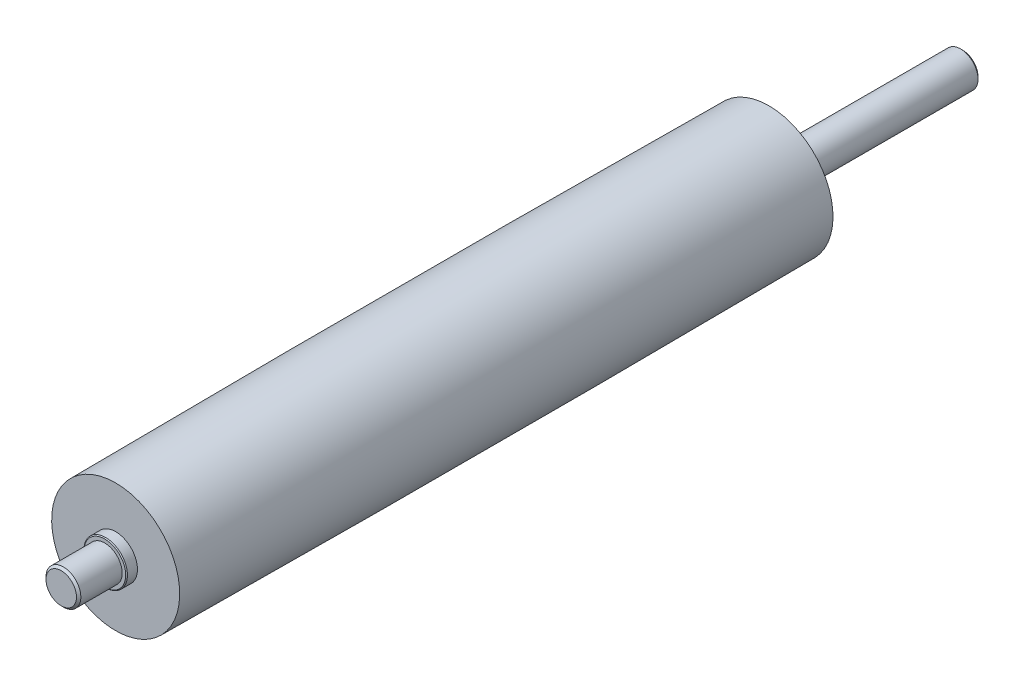
ISO-10303-21;
HEADER;
FILE_DESCRIPTION(('STEP AP214'),'2;1');
FILE_NAME('part.step','',(''),(''),'','','');
FILE_SCHEMA(('AUTOMOTIVE_DESIGN { 1 0 10303 214 1 1 1 1 }'));
ENDSEC;
DATA;
#1=APPLICATION_CONTEXT('core data for automotive mechanical design processes');
#2=APPLICATION_PROTOCOL_DEFINITION('international standard','automotive_design',2000,#1);
#3=PRODUCT_CONTEXT('',#1,'mechanical');
#4=PRODUCT('Part','Part','',(#3));
#5=PRODUCT_RELATED_PRODUCT_CATEGORY('part','',(#4));
#6=PRODUCT_DEFINITION_FORMATION('','',#4);
#7=PRODUCT_DEFINITION_CONTEXT('part definition',#1,'design');
#8=PRODUCT_DEFINITION('design','',#6,#7);
#9=PRODUCT_DEFINITION_SHAPE('','',#8);
#10=(LENGTH_UNIT() NAMED_UNIT(*) SI_UNIT(.MILLI.,.METRE.));
#11=(NAMED_UNIT(*) PLANE_ANGLE_UNIT() SI_UNIT($,.RADIAN.));
#12=(NAMED_UNIT(*) SI_UNIT($,.STERADIAN.) SOLID_ANGLE_UNIT());
#13=UNCERTAINTY_MEASURE_WITH_UNIT(LENGTH_MEASURE(1.E-05),#10,'distance_accuracy_value','');
#14=(GEOMETRIC_REPRESENTATION_CONTEXT(3) GLOBAL_UNCERTAINTY_ASSIGNED_CONTEXT((#13)) GLOBAL_UNIT_ASSIGNED_CONTEXT((#10,
#11,#12)) REPRESENTATION_CONTEXT('',''));
#15=CARTESIAN_POINT('',(0.,0.,0.));
#16=DIRECTION('',(0.,0.,1.));
#17=DIRECTION('',(1.,0.,0.));
#18=AXIS2_PLACEMENT_3D('',#15,#16,#17);
#19=CARTESIAN_POINT('',(0.,0.,-119.5));
#20=DIRECTION('',(0.,0.,-1.));
#21=DIRECTION('',(0.,1.,0.));
#22=AXIS2_PLACEMENT_3D('',#19,#20,#21);
#23=CYLINDRICAL_SURFACE('',#22,6.);
#24=CARTESIAN_POINT('',(0.,0.,-75.));
#25=DIRECTION('',(0.,0.,-1.));
#26=DIRECTION('',(0.,1.,0.));
#27=AXIS2_PLACEMENT_3D('',#24,#25,#26);
#28=CIRCLE('',#27,6.);
#29=CARTESIAN_POINT('',(0.,6.00000000000001,-75.));
#30=VERTEX_POINT('',#29);
#31=EDGE_CURVE('E58',#30,#30,#28,.T.);
#32=ORIENTED_EDGE('',*,*,#31,.T.);
#33=EDGE_LOOP('',(#32));
#34=FACE_BOUND('',#33,.T.);
#35=CARTESIAN_POINT('',(0.,0.,-77.5));
#36=DIRECTION('',(0.,0.,-1.));
#37=DIRECTION('',(0.,1.,0.));
#38=AXIS2_PLACEMENT_3D('',#35,#36,#37);
#39=CIRCLE('',#38,6.);
#40=CARTESIAN_POINT('',(0.,6.00000000000001,-77.5));
#41=VERTEX_POINT('',#40);
#42=EDGE_CURVE('E76',#41,#41,#39,.T.);
#43=ORIENTED_EDGE('',*,*,#42,.F.);
#44=EDGE_LOOP('',(#43));
#45=FACE_BOUND('',#44,.T.);
#46=ADVANCED_FACE('F32',(#34,#45),#23,.T.);
#47=CARTESIAN_POINT('',(0.,6.00000000000001,-75.0000000000005));
#48=DIRECTION('',(0.,0.,-1.));
#49=DIRECTION('',(0.,1.,0.));
#50=AXIS2_PLACEMENT_3D('',#47,#48,#49);
#51=PLANE('',#50);
#52=CARTESIAN_POINT('',(0.,0.,-75.0000000000009));
#53=DIRECTION('',(0.,0.,-1.));
#54=DIRECTION('',(0.,1.,0.));
#55=AXIS2_PLACEMENT_3D('',#52,#53,#54);
#56=CIRCLE('',#55,14.6999999999995);
#57=CARTESIAN_POINT('',(0.,14.6999999999995,-75.0000000000009));
#58=VERTEX_POINT('',#57);
#59=EDGE_CURVE('E61',#58,#58,#56,.T.);
#60=ORIENTED_EDGE('',*,*,#59,.T.);
#61=EDGE_LOOP('',(#60));
#62=FACE_BOUND('',#61,.T.);
#63=ORIENTED_EDGE('',*,*,#31,.F.);
#64=EDGE_LOOP('',(#63));
#65=FACE_BOUND('',#64,.T.);
#66=ADVANCED_FACE('F84',(#62,#65),#51,.T.);
#67=CARTESIAN_POINT('',(0.,0.,1.1518563880486E-12));
#68=DIRECTION('',(0.,0.,-1.));
#69=DIRECTION('',(0.,1.,0.));
#70=AXIS2_PLACEMENT_3D('',#67,#68,#69);
#71=DEGENERATE_TOROIDAL_SURFACE('',#70,9360.15000000304,9375.15000000304,.F.);
#72=CARTESIAN_POINT('',(0.,0.,75.));
#73=DIRECTION('',(0.,0.,-1.));
#74=DIRECTION('',(0.,1.,0.));
#75=AXIS2_PLACEMENT_3D('',#72,#73,#74);
#76=CIRCLE('',#75,14.7000000000001);
#77=CARTESIAN_POINT('',(0.,14.7000000000001,75.));
#78=VERTEX_POINT('',#77);
#79=EDGE_CURVE('E64',#78,#78,#76,.T.);
#80=ORIENTED_EDGE('',*,*,#79,.T.);
#81=EDGE_LOOP('',(#80));
#82=FACE_BOUND('',#81,.T.);
#83=ORIENTED_EDGE('',*,*,#59,.F.);
#84=EDGE_LOOP('',(#83));
#85=FACE_BOUND('',#84,.T.);
#86=ADVANCED_FACE('F90',(#82,#85),#71,.F.);
#87=CARTESIAN_POINT('',(0.,14.7000000000001,75.));
#88=DIRECTION('',(0.,0.,1.));
#89=DIRECTION('',(0.,-1.,0.));
#90=AXIS2_PLACEMENT_3D('',#87,#88,#89);
#91=PLANE('',#90);
#92=CARTESIAN_POINT('',(0.,0.,75.));
#93=DIRECTION('',(0.,0.,-1.));
#94=DIRECTION('',(0.,1.,0.));
#95=AXIS2_PLACEMENT_3D('',#92,#93,#94);
#96=CIRCLE('',#95,5.00000000000001);
#97=CARTESIAN_POINT('',(0.,4.99999999999999,75.));
#98=VERTEX_POINT('',#97);
#99=EDGE_CURVE('E67',#98,#98,#96,.T.);
#100=ORIENTED_EDGE('',*,*,#99,.T.);
#101=EDGE_LOOP('',(#100));
#102=FACE_BOUND('',#101,.T.);
#103=ORIENTED_EDGE('',*,*,#79,.F.);
#104=EDGE_LOOP('',(#103));
#105=FACE_BOUND('',#104,.T.);
#106=ADVANCED_FACE('F134',(#102,#105),#91,.T.);
#107=CARTESIAN_POINT('',(0.,0.,-119.5));
#108=DIRECTION('',(0.,0.,-1.));
#109=DIRECTION('',(0.,1.,0.));
#110=AXIS2_PLACEMENT_3D('',#107,#108,#109);
#111=CYLINDRICAL_SURFACE('',#110,5.00000000000001);
#112=CARTESIAN_POINT('',(0.,0.,77.3));
#113=DIRECTION('',(0.,0.,1.));
#114=DIRECTION('',(0.,-1.,0.));
#115=AXIS2_PLACEMENT_3D('',#112,#113,#114);
#116=CIRCLE('',#115,5.00000000000001);
#117=CARTESIAN_POINT('',(0.,4.99999999999999,77.3));
#118=VERTEX_POINT('',#117);
#119=EDGE_CURVE('E39',#118,#118,#116,.F.);
#120=ORIENTED_EDGE('',*,*,#119,.T.);
#121=EDGE_LOOP('',(#120));
#122=FACE_BOUND('',#121,.T.);
#123=ORIENTED_EDGE('',*,*,#99,.F.);
#124=EDGE_LOOP('',(#123));
#125=FACE_BOUND('',#124,.T.);
#126=ADVANCED_FACE('F131',(#122,#125),#111,.T.);
#127=CARTESIAN_POINT('',(0.,4.99999999999999,77.5));
#128=DIRECTION('',(0.,0.,1.));
#129=DIRECTION('',(0.,-1.,0.));
#130=AXIS2_PLACEMENT_3D('',#127,#128,#129);
#131=PLANE('',#130);
#132=CARTESIAN_POINT('',(0.,0.,77.5));
#133=DIRECTION('',(0.,0.,1.));
#134=DIRECTION('',(0.,-1.,0.));
#135=AXIS2_PLACEMENT_3D('',#132,#133,#134);
#136=CIRCLE('',#135,4.80000000000008);
#137=CARTESIAN_POINT('',(0.,4.80000000000006,77.5));
#138=VERTEX_POINT('',#137);
#139=EDGE_CURVE('E10',#138,#138,#136,.T.);
#140=ORIENTED_EDGE('',*,*,#139,.T.);
#141=EDGE_LOOP('',(#140));
#142=FACE_BOUND('',#141,.T.);
#143=CARTESIAN_POINT('',(0.,0.,77.5));
#144=DIRECTION('',(0.,0.,-1.));
#145=DIRECTION('',(0.,1.,0.));
#146=AXIS2_PLACEMENT_3D('',#143,#144,#145);
#147=CIRCLE('',#146,4.00000000000002);
#148=CARTESIAN_POINT('',(0.,4.,77.5));
#149=VERTEX_POINT('',#148);
#150=EDGE_CURVE('E70',#149,#149,#147,.T.);
#151=ORIENTED_EDGE('',*,*,#150,.T.);
#152=EDGE_LOOP('',(#151));
#153=FACE_BOUND('',#152,.T.);
#154=ADVANCED_FACE('F127',(#142,#153),#131,.T.);
#155=CARTESIAN_POINT('',(0.,0.,-119.5));
#156=DIRECTION('',(0.,0.,-1.));
#157=DIRECTION('',(0.,1.,0.));
#158=AXIS2_PLACEMENT_3D('',#155,#156,#157);
#159=CYLINDRICAL_SURFACE('',#158,4.00000000000002);
#160=CARTESIAN_POINT('',(0.,0.,87.));
#161=DIRECTION('',(0.,0.,1.));
#162=DIRECTION('',(0.,-1.,0.));
#163=AXIS2_PLACEMENT_3D('',#160,#161,#162);
#164=CIRCLE('',#163,4.00000000000002);
#165=CARTESIAN_POINT('',(0.,-4.00000000000004,87.));
#166=VERTEX_POINT('',#165);
#167=EDGE_CURVE('E55',#166,#166,#164,.F.);
#168=ORIENTED_EDGE('',*,*,#167,.T.);
#169=EDGE_LOOP('',(#168));
#170=FACE_BOUND('',#169,.T.);
#171=ORIENTED_EDGE('',*,*,#150,.F.);
#172=EDGE_LOOP('',(#171));
#173=FACE_BOUND('',#172,.T.);
#174=ADVANCED_FACE('F120',(#170,#173),#159,.T.);
#175=CARTESIAN_POINT('',(0.,4.,87.5));
#176=DIRECTION('',(0.,0.,1.));
#177=DIRECTION('',(0.,-1.,0.));
#178=AXIS2_PLACEMENT_3D('',#175,#176,#177);
#179=PLANE('',#178);
#180=CARTESIAN_POINT('',(0.,0.,87.5));
#181=DIRECTION('',(0.,0.,1.));
#182=DIRECTION('',(0.,-1.,0.));
#183=AXIS2_PLACEMENT_3D('',#180,#181,#182);
#184=CIRCLE('',#183,3.50000000000002);
#185=CARTESIAN_POINT('',(0.,-3.50000000000004,87.5));
#186=VERTEX_POINT('',#185);
#187=EDGE_CURVE('E52',#186,#186,#184,.T.);
#188=ORIENTED_EDGE('',*,*,#187,.T.);
#189=EDGE_LOOP('',(#188));
#190=FACE_BOUND('',#189,.T.);
#191=ADVANCED_FACE('F112',(#190),#179,.T.);
#192=CARTESIAN_POINT('',(0.,0.,-119.5));
#193=DIRECTION('',(0.,0.,-1.));
#194=DIRECTION('',(0.,1.,0.));
#195=AXIS2_PLACEMENT_3D('',#192,#193,#194);
#196=PLANE('',#195);
#197=CARTESIAN_POINT('',(0.,0.,-119.5));
#198=DIRECTION('',(0.,0.,-1.));
#199=DIRECTION('',(0.,1.,0.));
#200=AXIS2_PLACEMENT_3D('',#197,#198,#199);
#201=CIRCLE('',#200,3.50000000000003);
#202=CARTESIAN_POINT('',(0.,3.50000000000004,-119.5));
#203=VERTEX_POINT('',#202);
#204=EDGE_CURVE('E47',#203,#203,#201,.T.);
#205=ORIENTED_EDGE('',*,*,#204,.T.);
#206=EDGE_LOOP('',(#205));
#207=FACE_BOUND('',#206,.T.);
#208=ADVANCED_FACE('F109',(#207),#196,.T.);
#209=CARTESIAN_POINT('',(0.,0.,-119.5));
#210=DIRECTION('',(0.,0.,-1.));
#211=DIRECTION('',(0.,1.,0.));
#212=AXIS2_PLACEMENT_3D('',#209,#210,#211);
#213=CYLINDRICAL_SURFACE('',#212,4.);
#214=CARTESIAN_POINT('',(0.,0.,-119.));
#215=DIRECTION('',(0.,0.,-1.));
#216=DIRECTION('',(0.,1.,0.));
#217=AXIS2_PLACEMENT_3D('',#214,#215,#216);
#218=CIRCLE('',#217,4.);
#219=CARTESIAN_POINT('',(0.,4.00000000000001,-119.));
#220=VERTEX_POINT('',#219);
#221=EDGE_CURVE('E43',#220,#220,#218,.F.);
#222=ORIENTED_EDGE('',*,*,#221,.T.);
#223=EDGE_LOOP('',(#222));
#224=FACE_BOUND('',#223,.T.);
#225=CARTESIAN_POINT('',(0.,0.,-77.5));
#226=DIRECTION('',(0.,0.,-1.));
#227=DIRECTION('',(0.,1.,0.));
#228=AXIS2_PLACEMENT_3D('',#225,#226,#227);
#229=CIRCLE('',#228,4.);
#230=CARTESIAN_POINT('',(0.,4.00000000000001,-77.5));
#231=VERTEX_POINT('',#230);
#232=EDGE_CURVE('E73',#231,#231,#229,.T.);
#233=ORIENTED_EDGE('',*,*,#232,.T.);
#234=EDGE_LOOP('',(#233));
#235=FACE_BOUND('',#234,.T.);
#236=ADVANCED_FACE('F111',(#224,#235),#213,.T.);
#237=CARTESIAN_POINT('',(0.,6.00000000000001,-77.5));
#238=DIRECTION('',(0.,0.,-1.));
#239=DIRECTION('',(0.,1.,0.));
#240=AXIS2_PLACEMENT_3D('',#237,#238,#239);
#241=PLANE('',#240);
#242=ORIENTED_EDGE('',*,*,#42,.T.);
#243=EDGE_LOOP('',(#242));
#244=FACE_BOUND('',#243,.T.);
#245=ORIENTED_EDGE('',*,*,#232,.F.);
#246=EDGE_LOOP('',(#245));
#247=FACE_BOUND('',#246,.T.);
#248=ADVANCED_FACE('F80',(#244,#247),#241,.T.);
#249=CARTESIAN_POINT('',(0.,0.,87.));
#250=DIRECTION('',(0.,0.,-1.));
#251=DIRECTION('',(0.,1.,0.));
#252=AXIS2_PLACEMENT_3D('',#249,#250,#251);
#253=CONICAL_SURFACE('',#252,4.00000000000002,0.785398163397435);
#254=ORIENTED_EDGE('',*,*,#187,.F.);
#255=EDGE_LOOP('',(#254));
#256=FACE_BOUND('',#255,.T.);
#257=ORIENTED_EDGE('',*,*,#167,.F.);
#258=EDGE_LOOP('',(#257));
#259=FACE_BOUND('',#258,.T.);
#260=ADVANCED_FACE('F95',(#256,#259),#253,.T.);
#261=CARTESIAN_POINT('',(0.,0.,-119.5));
#262=DIRECTION('',(0.,0.,1.));
#263=DIRECTION('',(0.,-1.,0.));
#264=AXIS2_PLACEMENT_3D('',#261,#262,#263);
#265=CONICAL_SURFACE('',#264,3.50000000000003,0.785398163397435);
#266=ORIENTED_EDGE('',*,*,#221,.F.);
#267=EDGE_LOOP('',(#266));
#268=FACE_BOUND('',#267,.T.);
#269=ORIENTED_EDGE('',*,*,#204,.F.);
#270=EDGE_LOOP('',(#269));
#271=FACE_BOUND('',#270,.T.);
#272=ADVANCED_FACE('F97',(#268,#271),#265,.T.);
#273=CARTESIAN_POINT('',(0.,0.,77.3));
#274=DIRECTION('',(0.,0.,-1.));
#275=DIRECTION('',(0.,1.,0.));
#276=AXIS2_PLACEMENT_3D('',#273,#274,#275);
#277=CONICAL_SURFACE('',#276,5.00000000000001,0.785398163397325);
#278=CARTESIAN_POINT('',(0.,4.80000000000006,77.5));
#279=CARTESIAN_POINT('',(0.,4.80208333333339,77.4979166666667));
#280=CARTESIAN_POINT('',(0.,4.80416666666672,77.4958333333334));
#281=CARTESIAN_POINT('',(0.,4.80833333333339,77.4916666666667));
#282=CARTESIAN_POINT('',(0.,4.81041666666672,77.4895833333334));
#283=CARTESIAN_POINT('',(0.,4.81458333333338,77.4854166666667));
#284=CARTESIAN_POINT('',(0.,4.81666666666672,77.4833333333334));
#285=CARTESIAN_POINT('',(0.,4.82083333333338,77.4791666666667));
#286=CARTESIAN_POINT('',(0.,4.82291666666672,77.4770833333334));
#287=CARTESIAN_POINT('',(0.,4.82708333333338,77.4729166666667));
#288=CARTESIAN_POINT('',(0.,4.82916666666671,77.4708333333334));
#289=CARTESIAN_POINT('',(0.,4.83333333333338,77.4666666666667));
#290=CARTESIAN_POINT('',(0.,4.83541666666671,77.4645833333334));
#291=CARTESIAN_POINT('',(0.,4.83958333333338,77.4604166666667));
#292=CARTESIAN_POINT('',(0.,4.84166666666671,77.4583333333334));
#293=CARTESIAN_POINT('',(0.,4.84583333333337,77.4541666666667));
#294=CARTESIAN_POINT('',(0.,4.84791666666671,77.4520833333334));
#295=CARTESIAN_POINT('',(0.,4.85208333333337,77.4479166666667));
#296=CARTESIAN_POINT('',(0.,4.8541666666667,77.4458333333334));
#297=CARTESIAN_POINT('',(0.,4.85833333333337,77.4416666666667));
#298=CARTESIAN_POINT('',(0.,4.8604166666667,77.4395833333334));
#299=CARTESIAN_POINT('',(0.,4.86458333333337,77.4354166666667));
#300=CARTESIAN_POINT('',(0.,4.8666666666667,77.4333333333334));
#301=CARTESIAN_POINT('',(0.,4.87083333333336,77.4291666666667));
#302=CARTESIAN_POINT('',(0.,4.8729166666667,77.4270833333334));
#303=CARTESIAN_POINT('',(0.,4.87708333333336,77.4229166666667));
#304=CARTESIAN_POINT('',(0.,4.8791666666667,77.4208333333334));
#305=CARTESIAN_POINT('',(0.,4.88333333333336,77.4166666666667));
#306=CARTESIAN_POINT('',(0.,4.88541666666669,77.4145833333334));
#307=CARTESIAN_POINT('',(0.,4.88958333333336,77.4104166666667));
#308=CARTESIAN_POINT('',(0.,4.89166666666669,77.4083333333334));
#309=CARTESIAN_POINT('',(0.,4.89583333333336,77.4041666666667));
#310=CARTESIAN_POINT('',(0.,4.89791666666669,77.4020833333334));
#311=CARTESIAN_POINT('',(0.,4.90208333333335,77.3979166666667));
#312=CARTESIAN_POINT('',(0.,4.90416666666669,77.3958333333334));
#313=CARTESIAN_POINT('',(0.,4.90833333333335,77.3916666666667));
#314=CARTESIAN_POINT('',(0.,4.91041666666668,77.3895833333334));
#315=CARTESIAN_POINT('',(0.,4.91458333333335,77.3854166666667));
#316=CARTESIAN_POINT('',(0.,4.91666666666668,77.3833333333334));
#317=CARTESIAN_POINT('',(0.,4.92083333333335,77.3791666666667));
#318=CARTESIAN_POINT('',(0.,4.92291666666668,77.3770833333334));
#319=CARTESIAN_POINT('',(0.,4.92708333333334,77.3729166666667));
#320=CARTESIAN_POINT('',(0.,4.92916666666668,77.3708333333334));
#321=CARTESIAN_POINT('',(0.,4.93333333333334,77.3666666666667));
#322=CARTESIAN_POINT('',(0.,4.93541666666667,77.3645833333334));
#323=CARTESIAN_POINT('',(0.,4.93958333333334,77.3604166666667));
#324=CARTESIAN_POINT('',(0.,4.94166666666667,77.3583333333334));
#325=CARTESIAN_POINT('',(0.,4.94583333333334,77.3541666666667));
#326=CARTESIAN_POINT('',(0.,4.94791666666667,77.3520833333334));
#327=CARTESIAN_POINT('',(0.,4.95208333333333,77.3479166666667));
#328=CARTESIAN_POINT('',(0.,4.95416666666667,77.3458333333334));
#329=CARTESIAN_POINT('',(0.,4.95833333333333,77.3416666666667));
#330=CARTESIAN_POINT('',(0.,4.96041666666667,77.3395833333334));
#331=CARTESIAN_POINT('',(0.,4.96458333333333,77.3354166666667));
#332=CARTESIAN_POINT('',(0.,4.96666666666666,77.3333333333334));
#333=CARTESIAN_POINT('',(0.,4.97083333333333,77.3291666666667));
#334=CARTESIAN_POINT('',(0.,4.97291666666666,77.3270833333334));
#335=CARTESIAN_POINT('',(0.,4.97708333333333,77.3229166666667));
#336=CARTESIAN_POINT('',(0.,4.97916666666666,77.3208333333334));
#337=CARTESIAN_POINT('',(0.,4.98333333333332,77.3166666666667));
#338=CARTESIAN_POINT('',(0.,4.98541666666666,77.3145833333334));
#339=CARTESIAN_POINT('',(0.,4.98958333333332,77.3104166666667));
#340=CARTESIAN_POINT('',(0.,4.99166666666666,77.3083333333334));
#341=CARTESIAN_POINT('',(0.,4.99583333333332,77.3041666666667));
#342=CARTESIAN_POINT('',(0.,4.99791666666665,77.3020833333334));
#343=CARTESIAN_POINT('',(0.,4.99999999999999,77.3));
#344=B_SPLINE_CURVE_WITH_KNOTS('',3,(#278,#279,#280,#281,#282,#283,#284,#285,#286,#287,#288,
#289,#290,#291,#292,#293,#294,#295,#296,#297,#298,#299,#300,#301,#302,#303,#304,#305,#306,#307,
#308,#309,#310,#311,#312,#313,#314,#315,#316,#317,#318,#319,#320,#321,#322,#323,#324,#325,#326,
#327,#328,#329,#330,#331,#332,#333,#334,#335,#336,#337,#338,#339,#340,#341,#342,#343),
.UNSPECIFIED.,.F.,.F.,(4,2,2,2,2,2,2,2,2,2,2,2,2,2,2,2,2,2,2,2,2,2,2,2,2,2,2,2,2,2,2,2,4),(0.,
0.00883883476482964,0.0176776695296593,0.0265165042944895,0.0353553390593192,0.0441941738241488,
0.0530330085889785,0.0618718433538081,0.0707106781186384,0.079549512883468,0.0883883476482977,
0.0972271824131273,0.106066017177967,0.114904851942787,0.123743686707617,0.132582521472447,
0.141421356237276,0.150260191002106,0.159099025766936,0.167937860531766,0.176776695296595,
0.185615530061426,0.194454364826255,0.203293199591085,0.212132034355924,0.220970869120754,
0.229809703885584,0.238648538650414,0.247487373415243,0.256326208180073,0.265165042944903,
0.274003877709733,0.282842712474563),.UNSPECIFIED.);
#345=EDGE_CURVE('BSEAM34',#138,#118,#344,.T.);
#346=ORIENTED_EDGE('',*,*,#139,.F.);
#347=ORIENTED_EDGE('',*,*,#119,.F.);
#348=ORIENTED_EDGE('',*,*,#345,.T.);
#349=ORIENTED_EDGE('',*,*,#345,.F.);
#350=EDGE_LOOP('',(#346,#348,#347,#349));
#351=FACE_BOUND('',#350,.T.);
#352=ADVANCED_FACE('F34',(#351),#277,.T.);
#353=CLOSED_SHELL('',(#46,#66,#86,#106,#126,#154,#174,#191,#208,#236,#248,#260,#272,#352));
#354=MANIFOLD_SOLID_BREP('B2',#353);
#355=ADVANCED_BREP_SHAPE_REPRESENTATION('',(#18,#354),#14);
#356=SHAPE_DEFINITION_REPRESENTATION(#9,#355);
ENDSEC;
END-ISO-10303-21;
